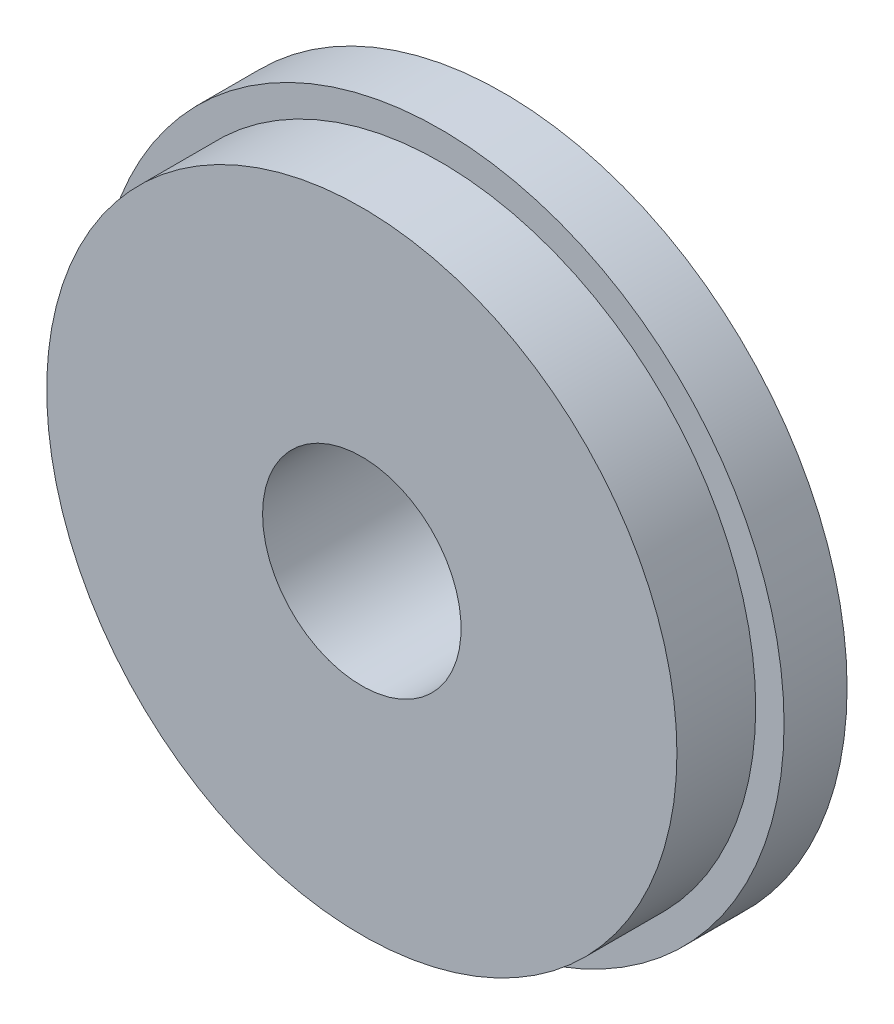
ISO-10303-21;
HEADER;
FILE_DESCRIPTION(('STEP AP214'),'2;1');
FILE_NAME('part.step','',(''),(''),'','','');
FILE_SCHEMA(('AUTOMOTIVE_DESIGN { 1 0 10303 214 1 1 1 1 }'));
ENDSEC;
DATA;
#1=APPLICATION_CONTEXT('core data for automotive mechanical design processes');
#2=APPLICATION_PROTOCOL_DEFINITION('international standard','automotive_design',2000,#1);
#3=PRODUCT_CONTEXT('',#1,'mechanical');
#4=PRODUCT('Part','Part','',(#3));
#5=PRODUCT_RELATED_PRODUCT_CATEGORY('part','',(#4));
#6=PRODUCT_DEFINITION_FORMATION('','',#4);
#7=PRODUCT_DEFINITION_CONTEXT('part definition',#1,'design');
#8=PRODUCT_DEFINITION('design','',#6,#7);
#9=PRODUCT_DEFINITION_SHAPE('','',#8);
#10=(LENGTH_UNIT() NAMED_UNIT(*) SI_UNIT(.MILLI.,.METRE.));
#11=(NAMED_UNIT(*) PLANE_ANGLE_UNIT() SI_UNIT($,.RADIAN.));
#12=(NAMED_UNIT(*) SI_UNIT($,.STERADIAN.) SOLID_ANGLE_UNIT());
#13=UNCERTAINTY_MEASURE_WITH_UNIT(LENGTH_MEASURE(1.E-05),#10,'distance_accuracy_value','');
#14=(GEOMETRIC_REPRESENTATION_CONTEXT(3) GLOBAL_UNCERTAINTY_ASSIGNED_CONTEXT((#13)) GLOBAL_UNIT_ASSIGNED_CONTEXT((#10,
#11,#12)) REPRESENTATION_CONTEXT('',''));
#15=CARTESIAN_POINT('',(0.,0.,0.));
#16=DIRECTION('',(0.,0.,1.));
#17=DIRECTION('',(1.,0.,0.));
#18=AXIS2_PLACEMENT_3D('',#15,#16,#17);
#19=CARTESIAN_POINT('',(0.,0.,2.));
#20=DIRECTION('',(0.,0.,1.));
#21=DIRECTION('',(1.,0.,0.));
#22=AXIS2_PLACEMENT_3D('',#19,#20,#21);
#23=PLANE('',#22);
#24=CARTESIAN_POINT('',(0.,0.,2.));
#25=DIRECTION('',(0.,0.,1.));
#26=DIRECTION('',(1.,0.,0.));
#27=AXIS2_PLACEMENT_3D('',#24,#25,#26);
#28=CIRCLE('',#27,10.9);
#29=CARTESIAN_POINT('',(10.9,0.,2.));
#30=VERTEX_POINT('',#29);
#31=EDGE_CURVE('E10',#30,#30,#28,.T.);
#32=ORIENTED_EDGE('',*,*,#31,.T.);
#33=EDGE_LOOP('',(#32));
#34=FACE_BOUND('',#33,.T.);
#35=CARTESIAN_POINT('',(0.,0.,2.));
#36=DIRECTION('',(0.,0.,1.));
#37=DIRECTION('',(1.,0.,0.));
#38=AXIS2_PLACEMENT_3D('',#35,#36,#37);
#39=CIRCLE('',#38,10.);
#40=CARTESIAN_POINT('',(10.,0.,2.));
#41=VERTEX_POINT('',#40);
#42=EDGE_CURVE('E44',#41,#41,#39,.T.);
#43=ORIENTED_EDGE('',*,*,#42,.F.);
#44=EDGE_LOOP('',(#43));
#45=FACE_BOUND('',#44,.T.);
#46=ADVANCED_FACE('F31',(#34,#45),#23,.T.);
#47=CARTESIAN_POINT('',(0.,0.,2.));
#48=DIRECTION('',(0.,0.,-1.));
#49=DIRECTION('',(-1.,0.,0.));
#50=AXIS2_PLACEMENT_3D('',#47,#48,#49);
#51=CYLINDRICAL_SURFACE('',#50,10.9);
#52=ORIENTED_EDGE('',*,*,#31,.F.);
#53=EDGE_LOOP('',(#52));
#54=FACE_BOUND('',#53,.T.);
#55=CARTESIAN_POINT('',(0.,0.,0.));
#56=DIRECTION('',(0.,0.,1.));
#57=DIRECTION('',(1.,0.,0.));
#58=AXIS2_PLACEMENT_3D('',#55,#56,#57);
#59=CIRCLE('',#58,10.9);
#60=CARTESIAN_POINT('',(10.9,0.,0.));
#61=VERTEX_POINT('',#60);
#62=EDGE_CURVE('E35',#61,#61,#59,.T.);
#63=ORIENTED_EDGE('',*,*,#62,.T.);
#64=EDGE_LOOP('',(#63));
#65=FACE_BOUND('',#64,.T.);
#66=ADVANCED_FACE('F33',(#54,#65),#51,.T.);
#67=CARTESIAN_POINT('',(0.,0.,0.));
#68=DIRECTION('',(0.,0.,1.));
#69=DIRECTION('',(1.,0.,0.));
#70=AXIS2_PLACEMENT_3D('',#67,#68,#69);
#71=PLANE('',#70);
#72=CARTESIAN_POINT('',(0.,0.,0.));
#73=DIRECTION('',(0.,0.,-1.));
#74=DIRECTION('',(-1.,0.,0.));
#75=AXIS2_PLACEMENT_3D('',#72,#73,#74);
#76=CIRCLE('',#75,3.15);
#77=CARTESIAN_POINT('',(-3.15,0.,0.));
#78=VERTEX_POINT('',#77);
#79=EDGE_CURVE('E50',#78,#78,#76,.T.);
#80=ORIENTED_EDGE('',*,*,#79,.F.);
#81=EDGE_LOOP('',(#80));
#82=FACE_BOUND('',#81,.T.);
#83=ORIENTED_EDGE('',*,*,#62,.F.);
#84=EDGE_LOOP('',(#83));
#85=FACE_BOUND('',#84,.T.);
#86=ADVANCED_FACE('F65',(#82,#85),#71,.F.);
#87=CARTESIAN_POINT('',(0.,0.,4.5));
#88=DIRECTION('',(0.,0.,-1.));
#89=DIRECTION('',(-1.,0.,0.));
#90=AXIS2_PLACEMENT_3D('',#87,#88,#89);
#91=CYLINDRICAL_SURFACE('',#90,10.);
#92=CARTESIAN_POINT('',(0.,0.,4.5));
#93=DIRECTION('',(0.,0.,1.));
#94=DIRECTION('',(1.,0.,0.));
#95=AXIS2_PLACEMENT_3D('',#92,#93,#94);
#96=CIRCLE('',#95,10.);
#97=CARTESIAN_POINT('',(10.,0.,4.5));
#98=VERTEX_POINT('',#97);
#99=EDGE_CURVE('E42',#98,#98,#96,.T.);
#100=ORIENTED_EDGE('',*,*,#99,.F.);
#101=EDGE_LOOP('',(#100));
#102=FACE_BOUND('',#101,.T.);
#103=ORIENTED_EDGE('',*,*,#42,.T.);
#104=EDGE_LOOP('',(#103));
#105=FACE_BOUND('',#104,.T.);
#106=ADVANCED_FACE('F68',(#102,#105),#91,.T.);
#107=CARTESIAN_POINT('',(0.,0.,4.5));
#108=DIRECTION('',(0.,0.,1.));
#109=DIRECTION('',(1.,0.,0.));
#110=AXIS2_PLACEMENT_3D('',#107,#108,#109);
#111=PLANE('',#110);
#112=CARTESIAN_POINT('',(0.,0.,4.5));
#113=DIRECTION('',(0.,0.,-1.));
#114=DIRECTION('',(-1.,0.,0.));
#115=AXIS2_PLACEMENT_3D('',#112,#113,#114);
#116=CIRCLE('',#115,3.15);
#117=CARTESIAN_POINT('',(-3.15,0.,4.5));
#118=VERTEX_POINT('',#117);
#119=EDGE_CURVE('E47',#118,#118,#116,.T.);
#120=ORIENTED_EDGE('',*,*,#119,.T.);
#121=EDGE_LOOP('',(#120));
#122=FACE_BOUND('',#121,.T.);
#123=ORIENTED_EDGE('',*,*,#99,.T.);
#124=EDGE_LOOP('',(#123));
#125=FACE_BOUND('',#124,.T.);
#126=ADVANCED_FACE('F56',(#122,#125),#111,.T.);
#127=CARTESIAN_POINT('',(0.,0.,4.5));
#128=DIRECTION('',(0.,0.,-1.));
#129=DIRECTION('',(-1.,0.,0.));
#130=AXIS2_PLACEMENT_3D('',#127,#128,#129);
#131=CYLINDRICAL_SURFACE('',#130,3.15);
#132=ORIENTED_EDGE('',*,*,#119,.F.);
#133=EDGE_LOOP('',(#132));
#134=FACE_BOUND('',#133,.T.);
#135=ORIENTED_EDGE('',*,*,#79,.T.);
#136=EDGE_LOOP('',(#135));
#137=FACE_BOUND('',#136,.T.);
#138=ADVANCED_FACE('F59',(#134,#137),#131,.F.);
#139=CLOSED_SHELL('',(#46,#66,#86,#106,#126,#138));
#140=MANIFOLD_SOLID_BREP('B2',#139);
#141=ADVANCED_BREP_SHAPE_REPRESENTATION('',(#18,#140),#14);
#142=SHAPE_DEFINITION_REPRESENTATION(#9,#141);
ENDSEC;
END-ISO-10303-21;
